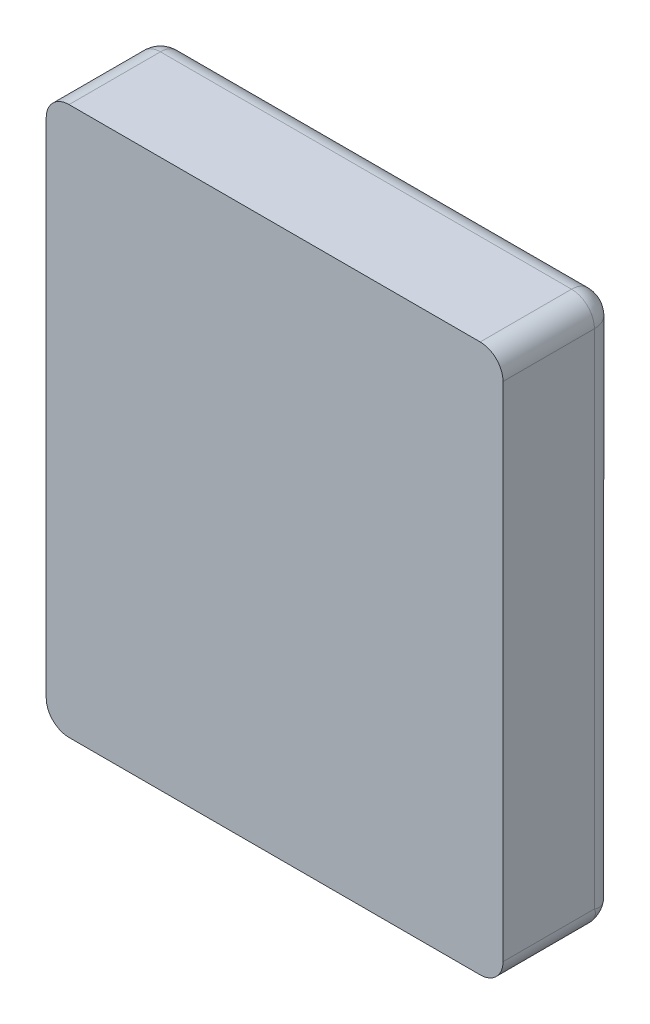
ISO-10303-21;
HEADER;
FILE_DESCRIPTION(('STEP AP214'),'2;1');
FILE_NAME('part.step','',(''),(''),'','','');
FILE_SCHEMA(('AUTOMOTIVE_DESIGN { 1 0 10303 214 1 1 1 1 }'));
ENDSEC;
DATA;
#1=APPLICATION_CONTEXT('core data for automotive mechanical design processes');
#2=APPLICATION_PROTOCOL_DEFINITION('international standard','automotive_design',2000,#1);
#3=PRODUCT_CONTEXT('',#1,'mechanical');
#4=PRODUCT('Part','Part','',(#3));
#5=PRODUCT_RELATED_PRODUCT_CATEGORY('part','',(#4));
#6=PRODUCT_DEFINITION_FORMATION('','',#4);
#7=PRODUCT_DEFINITION_CONTEXT('part definition',#1,'design');
#8=PRODUCT_DEFINITION('design','',#6,#7);
#9=PRODUCT_DEFINITION_SHAPE('','',#8);
#10=(LENGTH_UNIT() NAMED_UNIT(*) SI_UNIT(.MILLI.,.METRE.));
#11=(NAMED_UNIT(*) PLANE_ANGLE_UNIT() SI_UNIT($,.RADIAN.));
#12=(NAMED_UNIT(*) SI_UNIT($,.STERADIAN.) SOLID_ANGLE_UNIT());
#13=UNCERTAINTY_MEASURE_WITH_UNIT(LENGTH_MEASURE(1.E-05),#10,'distance_accuracy_value','');
#14=(GEOMETRIC_REPRESENTATION_CONTEXT(3) GLOBAL_UNCERTAINTY_ASSIGNED_CONTEXT((#13)) GLOBAL_UNIT_ASSIGNED_CONTEXT((#10,
#11,#12)) REPRESENTATION_CONTEXT('',''));
#15=CARTESIAN_POINT('',(0.,0.,0.));
#16=DIRECTION('',(0.,0.,1.));
#17=DIRECTION('',(1.,0.,0.));
#18=AXIS2_PLACEMENT_3D('',#15,#16,#17);
#19=CARTESIAN_POINT('',(2.2,1.55,0.05));
#20=DIRECTION('',(-0.40824829046386,-0.40824829046386,-0.816496580927729));
#21=DIRECTION('',(0.577350269189631,0.577350269189625,-0.577350269189622));
#22=AXIS2_PLACEMENT_3D('',#19,#20,#21);
#23=SPHERICAL_SURFACE('',#22,0.05);
#24=CARTESIAN_POINT('',(2.2,1.55,0.05));
#25=DIRECTION('',(0.,1.,0.));
#26=DIRECTION('',(0.,0.,-1.));
#27=AXIS2_PLACEMENT_3D('',#24,#25,#26);
#28=CIRCLE('',#27,0.05);
#29=CARTESIAN_POINT('',(2.25,1.55,0.05));
#30=VERTEX_POINT('',#29);
#31=CARTESIAN_POINT('',(2.2,1.55,0.));
#32=VERTEX_POINT('',#31);
#33=EDGE_CURVE('E11',#30,#32,#28,.T.);
#34=ORIENTED_EDGE('',*,*,#33,.T.);
#35=CARTESIAN_POINT('',(2.2,1.55,0.05));
#36=DIRECTION('',(1.,0.,0.));
#37=DIRECTION('',(0.,1.,0.));
#38=AXIS2_PLACEMENT_3D('',#35,#36,#37);
#39=CIRCLE('',#38,0.05);
#40=CARTESIAN_POINT('',(2.2,1.6,0.05));
#41=VERTEX_POINT('',#40);
#42=EDGE_CURVE('E24',#32,#41,#39,.T.);
#43=ORIENTED_EDGE('',*,*,#42,.T.);
#44=CARTESIAN_POINT('',(2.2,1.55,0.05));
#45=DIRECTION('',(0.,0.,-1.));
#46=DIRECTION('',(1.,0.,0.));
#47=AXIS2_PLACEMENT_3D('',#44,#45,#46);
#48=CIRCLE('',#47,0.05);
#49=EDGE_CURVE('E107',#41,#30,#48,.T.);
#50=ORIENTED_EDGE('',*,*,#49,.T.);
#51=EDGE_LOOP('',(#34,#43,#50));
#52=FACE_BOUND('',#51,.T.);
#53=ADVANCED_FACE('F17',(#52),#23,.T.);
#54=CARTESIAN_POINT('',(2.2,0.45,0.05));
#55=DIRECTION('',(-0.816496580927728,-0.408248290463861,-0.40824829046386));
#56=DIRECTION('',(0.577350269189622,-0.577350269189628,-0.577350269189627));
#57=AXIS2_PLACEMENT_3D('',#54,#55,#56);
#58=SPHERICAL_SURFACE('',#57,0.05);
#59=CARTESIAN_POINT('',(2.25,0.45,0.0499999999999998));
#60=CARTESIAN_POINT('',(2.2500000014759,0.449651799057068,0.0498405532686794));
#61=CARTESIAN_POINT('',(2.24999560007552,0.449301904667834,0.0496848150261169));
#62=CARTESIAN_POINT('',(2.24997796950743,0.448597828470979,0.0493801632160352));
#63=CARTESIAN_POINT('',(2.24996470752091,0.448243635548406,0.0492312772281741));
#64=CARTESIAN_POINT('',(2.24992926760641,0.447531331343161,0.048940381816176));
#65=CARTESIAN_POINT('',(2.24990705649925,0.44717321035739,0.048798400210219));
#66=CARTESIAN_POINT('',(2.24985363936352,0.446453420667875,0.0485213514872185));
#67=CARTESIAN_POINT('',(2.24982239989622,0.446091743694303,0.0483863123143094));
#68=CARTESIAN_POINT('',(2.24975085351182,0.445365215858316,0.048123176581545));
#69=CARTESIAN_POINT('',(2.2497105129861,0.445000358177561,0.0479951079959893));
#70=CARTESIAN_POINT('',(2.24962069975311,0.444267846578135,0.0477459310107218));
#71=CARTESIAN_POINT('',(2.24957119336077,0.443900187304339,0.0476248505186724));
#72=CARTESIAN_POINT('',(2.24946298976778,0.443162447258047,0.0473896555588762));
#73=CARTESIAN_POINT('',(2.2494042588909,0.442792362571634,0.0472755688333025));
#74=CARTESIAN_POINT('',(2.24927756015494,0.442050167395681,0.047054361118223));
#75=CARTESIAN_POINT('',(2.24920955873537,0.441678054492499,0.0469472676303905));
#76=CARTESIAN_POINT('',(2.2489912289485,0.440557187707727,0.0466358451686539));
#77=CARTESIAN_POINT('',(2.24882716569432,0.439807939572477,0.0464426562736404));
#78=CARTESIAN_POINT('',(2.24846180182021,0.438305940462555,0.0460837510376662));
#79=CARTESIAN_POINT('',(2.24826023919175,0.437553203614566,0.045918244601583));
#80=CARTESIAN_POINT('',(2.24781974846915,0.436047214861804,0.0456142824809017));
#81=CARTESIAN_POINT('',(2.24758056582694,0.435293997073049,0.0454760267006071));
#82=CARTESIAN_POINT('',(2.24706485201088,0.433790104728138,0.0452260083926237));
#83=CARTESIAN_POINT('',(2.24678807615493,0.433039482961546,0.0451144338874249));
#84=CARTESIAN_POINT('',(2.24619732289344,0.431543791912131,0.0449170570292828));
#85=CARTESIAN_POINT('',(2.2458831127108,0.430798791652052,0.0448314290670077));
#86=CARTESIAN_POINT('',(2.24521777475648,0.429317319104762,0.0446850740184743));
#87=CARTESIAN_POINT('',(2.24486642792602,0.428580929542474,0.0446245063781685));
#88=CARTESIAN_POINT('',(2.24412723787,0.427119599086168,0.044527253768801));
#89=CARTESIAN_POINT('',(2.24373919083561,0.426394751815757,0.0444907123562372));
#90=CARTESIAN_POINT('',(2.24292716009926,0.424959360939523,0.0444403540608963));
#91=CARTESIAN_POINT('',(2.24250298909048,0.424248918912744,0.044426664286739));
#92=CARTESIAN_POINT('',(2.24161940890336,0.422845114554765,0.0444207181221763));
#93=CARTESIAN_POINT('',(2.24115982988534,0.422151858721145,0.0444285722064916));
#94=CARTESIAN_POINT('',(2.24020627067896,0.420785111651415,0.0444642974692499));
#95=CARTESIAN_POINT('',(2.23971213879615,0.420111728763673,0.0444922626613214));
#96=CARTESIAN_POINT('',(2.23869044842568,0.418787309441907,0.0445666771817415));
#97=CARTESIAN_POINT('',(2.23816275678178,0.418136380160979,0.0446132045740465));
#98=CARTESIAN_POINT('',(2.23707505745919,0.416859335503659,0.0447231029909741));
#99=CARTESIAN_POINT('',(2.23651493527515,0.416233323109753,0.0447865369560408));
#100=CARTESIAN_POINT('',(2.2353636192483,0.415008454460619,0.0449285101707249));
#101=CARTESIAN_POINT('',(2.2347723293902,0.414409694156524,0.0450070983509291));
#102=CARTESIAN_POINT('',(2.23356005336898,0.413241536515073,0.0451775540422923));
#103=CARTESIAN_POINT('',(2.23293898925504,0.412672225390671,0.0452694578455206));
#104=CARTESIAN_POINT('',(2.23166866760279,0.411565028009956,0.045464641942522));
#105=CARTESIAN_POINT('',(2.23101934949802,0.411027215710412,0.0455679474870254));
#106=CARTESIAN_POINT('',(2.22969414620939,0.409984924151519,0.0457839664838229));
#107=CARTESIAN_POINT('',(2.2290182169205,0.409480504294321,0.0458966959351089));
#108=CARTESIAN_POINT('',(2.22764153641367,0.408506744022157,0.0461295399317951));
#109=CARTESIAN_POINT('',(2.22694075639946,0.408037446402736,0.0462496631718509));
#110=CARTESIAN_POINT('',(2.22551623315645,0.407135507998663,0.046495229519472));
#111=CARTESIAN_POINT('',(2.22479247507204,0.406702891620645,0.0466206760870282));
#112=CARTESIAN_POINT('',(2.2233239621661,0.405875717680122,0.0468747935125628));
#113=CARTESIAN_POINT('',(2.22257920486178,0.405481164642535,0.0470034647516007));
#114=CARTESIAN_POINT('',(2.22107076141787,0.404731338415788,0.0472619178362775));
#115=CARTESIAN_POINT('',(2.2203070834178,0.40437604868312,0.0473916991891467));
#116=CARTESIAN_POINT('',(2.21876296105217,0.40370578451402,0.0476502530710441));
#117=CARTESIAN_POINT('',(2.21798253353389,0.403390771598533,0.0477790264509255));
#118=CARTESIAN_POINT('',(2.21640716184318,0.402801907185964,0.0480334516240748));
#119=CARTESIAN_POINT('',(2.21561224116745,0.402527994737248,0.0481591078044245));
#120=CARTESIAN_POINT('',(2.21401021227114,0.402021985315631,0.0484052048771467));
#121=CARTESIAN_POINT('',(2.21320313201674,0.401789804718976,0.0485256558233742));
#122=CARTESIAN_POINT('',(2.21157918442682,0.401367718941433,0.0487592801323913));
#123=CARTESIAN_POINT('',(2.21076234724915,0.401177707607652,0.0488724712471381));
#124=CARTESIAN_POINT('',(2.20912134835722,0.400840226036591,0.0490895570997498));
#125=CARTESIAN_POINT('',(2.20829721664536,0.400692627601644,0.0491934791832936));
#126=CARTESIAN_POINT('',(2.20664414679495,0.400440040497442,0.0493900639666642));
#127=CARTESIAN_POINT('',(2.20581523610608,0.400334902420738,0.0494827653283566));
#128=CARTESIAN_POINT('',(2.20415516357154,0.400167119131942,0.0496550119985609));
#129=CARTESIAN_POINT('',(2.20332402424875,0.400104304434963,0.0497346088043771));
#130=CARTESIAN_POINT('',(2.20166211112483,0.400020828682451,0.0498788316884434));
#131=CARTESIAN_POINT('',(2.20083135242767,0.399999979686033,0.0499435233591183));
#132=CARTESIAN_POINT('',(2.2,0.4,0.0500000000000001));
#133=B_SPLINE_CURVE_WITH_KNOTS('',3,(#59,#60,#61,#62,#63,#64,#65,#66,#67,#68,#69,#70,#71,#72,
#73,#74,#75,#76,#77,#78,#79,#80,#81,#82,#83,#84,#85,#86,#87,#88,#89,#90,#91,#92,#93,#94,#95,#96,
#97,#98,#99,#100,#101,#102,#103,#104,#105,#106,#107,#108,#109,#110,#111,#112,#113,#114,#115,
#116,#117,#118,#119,#120,#121,#122,#123,#124,#125,#126,#127,#128,#129,#130,#131,#132),
.UNSPECIFIED.,.F.,.F.,(4,2,2,2,2,2,2,2,2,2,2,2,2,2,2,2,2,2,2,2,2,2,2,2,2,2,2,2,2,2,2,2,2,2,2,2,
4),(0.,0.00114886127774822,0.00230200160017932,0.00345945716025889,0.004621255816402,
0.00578741713336718,0.00695795243877276,0.00813286489441382,0.00931214958156473,
0.0116835195945682,0.0140721270255091,0.0164776530081181,0.0188996616232038,0.0213376051995541,
0.0237908300995736,0.026258582918328,0.0287400170325545,0.0312341994438155,0.0337401178671161,
0.0362566880228797,0.0387827610961028,0.0413171313317718,0.0438585437402055,0.046405701889917,
0.0489572757688813,0.0515119096977958,0.0540682302810434,0.0566248543826749,0.0591803971157915,
0.0617334798343146,0.0642827381162205,0.0668268297269537,0.0693644425508582,0.0718943024771084,
0.0744151812247205,0.0769259040887937,0.0794253575870826),.UNSPECIFIED.);
#134=CARTESIAN_POINT('',(2.25,0.45,0.05));
#135=VERTEX_POINT('',#134);
#136=CARTESIAN_POINT('',(2.2,0.4,0.05));
#137=VERTEX_POINT('',#136);
#138=EDGE_CURVE('E280',#135,#137,#133,.T.);
#139=ORIENTED_EDGE('',*,*,#138,.T.);
#140=CARTESIAN_POINT('',(2.2,0.45,0.05));
#141=DIRECTION('',(1.,0.,0.));
#142=DIRECTION('',(0.,0.,-1.));
#143=AXIS2_PLACEMENT_3D('',#140,#141,#142);
#144=CIRCLE('',#143,0.05);
#145=CARTESIAN_POINT('',(2.2,0.45,0.));
#146=VERTEX_POINT('',#145);
#147=EDGE_CURVE('E272',#137,#146,#144,.T.);
#148=ORIENTED_EDGE('',*,*,#147,.T.);
#149=CARTESIAN_POINT('',(2.2,0.45,0.));
#150=CARTESIAN_POINT('',(2.20083135242767,0.449943523359118,-2.03139668969687E-08));
#151=CARTESIAN_POINT('',(2.20166211112483,0.449878831688443,2.08286824513829E-05));
#152=CARTESIAN_POINT('',(2.20332402424875,0.449734608804377,0.000104304434962557));
#153=CARTESIAN_POINT('',(2.20415516357154,0.449655011998561,0.000167119131942042));
#154=CARTESIAN_POINT('',(2.20581523610608,0.449482765328356,0.000334902420738287));
#155=CARTESIAN_POINT('',(2.20664414679495,0.449390063966664,0.000440040497442491));
#156=CARTESIAN_POINT('',(2.20829721664536,0.449193479183294,0.00069262760164451));
#157=CARTESIAN_POINT('',(2.20912134835722,0.44908955709975,0.000840226036591026));
#158=CARTESIAN_POINT('',(2.21076234724915,0.448872471247138,0.00117770760765164));
#159=CARTESIAN_POINT('',(2.21157918442682,0.448759280132391,0.00136771894143308));
#160=CARTESIAN_POINT('',(2.21320313201674,0.448525655823374,0.00178980471897601));
#161=CARTESIAN_POINT('',(2.21401021227114,0.448405204877147,0.00202198531563088));
#162=CARTESIAN_POINT('',(2.21561224116745,0.448159107804424,0.00252799473724829));
#163=CARTESIAN_POINT('',(2.21640716184318,0.448033451624075,0.00280190718596445));
#164=CARTESIAN_POINT('',(2.21798253353389,0.447779026450925,0.00339077159853349));
#165=CARTESIAN_POINT('',(2.21876296105217,0.447650253071044,0.0037057845140203));
#166=CARTESIAN_POINT('',(2.2203070834178,0.447391699189147,0.00437604868311969));
#167=CARTESIAN_POINT('',(2.22107076141787,0.447261917836277,0.00473133841578777));
#168=CARTESIAN_POINT('',(2.22257920486178,0.447003464751601,0.00548116464253514));
#169=CARTESIAN_POINT('',(2.2233239621661,0.446874793512563,0.00587571768012167));
#170=CARTESIAN_POINT('',(2.22479247507204,0.446620676087028,0.00670289162064457));
#171=CARTESIAN_POINT('',(2.22551623315645,0.446495229519472,0.00713550799866312));
#172=CARTESIAN_POINT('',(2.22694075639946,0.446249663171851,0.00803744640273559));
#173=CARTESIAN_POINT('',(2.22764153641367,0.446129539931795,0.00850674402215674));
#174=CARTESIAN_POINT('',(2.2290182169205,0.445896695935109,0.00948050429432061));
#175=CARTESIAN_POINT('',(2.22969414620938,0.445783966483823,0.00998492415151899));
#176=CARTESIAN_POINT('',(2.23101934949802,0.445567947487025,0.0110272157104115));
#177=CARTESIAN_POINT('',(2.23166866760279,0.445464641942522,0.011565028009956));
#178=CARTESIAN_POINT('',(2.23293898925504,0.445269457845521,0.0126722253906707));
#179=CARTESIAN_POINT('',(2.23356005336898,0.445177554042292,0.0132415365150733));
#180=CARTESIAN_POINT('',(2.2347723293902,0.445007098350929,0.014409694156524));
#181=CARTESIAN_POINT('',(2.2353636192483,0.444928510170725,0.0150084544606194));
#182=CARTESIAN_POINT('',(2.23651493527515,0.444786536956041,0.0162333231097525));
#183=CARTESIAN_POINT('',(2.23707505745919,0.444723102990974,0.0168593355036591));
#184=CARTESIAN_POINT('',(2.23816275678178,0.444613204574046,0.018136380160979));
#185=CARTESIAN_POINT('',(2.23869044842568,0.444566677181741,0.0187873094419069));
#186=CARTESIAN_POINT('',(2.23971213879615,0.444492262661321,0.020111728763673));
#187=CARTESIAN_POINT('',(2.24020627067896,0.44446429746925,0.0207851116514151));
#188=CARTESIAN_POINT('',(2.24115982988534,0.444428572206491,0.0221518587211451));
#189=CARTESIAN_POINT('',(2.24161940890336,0.444420718122176,0.0228451145547648));
#190=CARTESIAN_POINT('',(2.24250298909048,0.444426664286739,0.0242489189127444));
#191=CARTESIAN_POINT('',(2.24292716009926,0.444440354060896,0.0249593609395228));
#192=CARTESIAN_POINT('',(2.24373919083561,0.444490712356237,0.0263947518157566));
#193=CARTESIAN_POINT('',(2.24412723787,0.444527253768801,0.0271195990861676));
#194=CARTESIAN_POINT('',(2.24486642792602,0.444624506378168,0.0285809295424737));
#195=CARTESIAN_POINT('',(2.24521777475648,0.444685074018474,0.029317319104762));
#196=CARTESIAN_POINT('',(2.2458831127108,0.444831429067008,0.0307987916520523));
#197=CARTESIAN_POINT('',(2.24619732289344,0.444917057029283,0.0315437919121314));
#198=CARTESIAN_POINT('',(2.24678807615493,0.445114433887425,0.0330394829615456));
#199=CARTESIAN_POINT('',(2.24706485201088,0.445226008392624,0.0337901047281376));
#200=CARTESIAN_POINT('',(2.24758056582694,0.445476026700607,0.0352939970730489));
#201=CARTESIAN_POINT('',(2.24781974846915,0.445614282480902,0.0360472148618043));
#202=CARTESIAN_POINT('',(2.24826023919175,0.445918244601583,0.0375532036145657));
#203=CARTESIAN_POINT('',(2.24846180182021,0.446083751037666,0.0383059404625553));
#204=CARTESIAN_POINT('',(2.24882716569432,0.44644265627364,0.0398079395724775));
#205=CARTESIAN_POINT('',(2.2489912289485,0.446635845168654,0.0405571877077266));
#206=CARTESIAN_POINT('',(2.24920955873537,0.44694726763039,0.041678054492499));
#207=CARTESIAN_POINT('',(2.24927756015494,0.447054361118223,0.0420501673956812));
#208=CARTESIAN_POINT('',(2.2494042588909,0.447275568833302,0.0427923625716339));
#209=CARTESIAN_POINT('',(2.24946298976778,0.447389655558876,0.0431624472580471));
#210=CARTESIAN_POINT('',(2.24957119336077,0.447624850518672,0.0439001873043392));
#211=CARTESIAN_POINT('',(2.24962069975311,0.447745931010722,0.0442678465781352));
#212=CARTESIAN_POINT('',(2.2497105129861,0.447995107995989,0.0450003581775607));
#213=CARTESIAN_POINT('',(2.24975085351182,0.448123176581545,0.0453652158583163));
#214=CARTESIAN_POINT('',(2.24982239989622,0.448386312314309,0.0460917436943031));
#215=CARTESIAN_POINT('',(2.24985363936352,0.448521351487218,0.0464534206678747));
#216=CARTESIAN_POINT('',(2.24990705649925,0.448798400210219,0.0471732103573898));
#217=CARTESIAN_POINT('',(2.24992926760641,0.448940381816176,0.0475313313431614));
#218=CARTESIAN_POINT('',(2.24996470752091,0.449231277228174,0.0482436355484061));
#219=CARTESIAN_POINT('',(2.24997796950743,0.449380163216035,0.0485978284709787));
#220=CARTESIAN_POINT('',(2.24999560007552,0.449684815026117,0.0493019046678336));
#221=CARTESIAN_POINT('',(2.2500000014759,0.449840553268679,0.0496517990570677));
#222=CARTESIAN_POINT('',(2.25,0.45,0.0499999999999998));
#223=B_SPLINE_CURVE_WITH_KNOTS('',3,(#149,#150,#151,#152,#153,#154,#155,#156,#157,#158,#159,
#160,#161,#162,#163,#164,#165,#166,#167,#168,#169,#170,#171,#172,#173,#174,#175,#176,#177,#178,
#179,#180,#181,#182,#183,#184,#185,#186,#187,#188,#189,#190,#191,#192,#193,#194,#195,#196,#197,
#198,#199,#200,#201,#202,#203,#204,#205,#206,#207,#208,#209,#210,#211,#212,#213,#214,#215,#216,
#217,#218,#219,#220,#221,#222),.UNSPECIFIED.,.F.,.F.,(4,2,2,2,2,2,2,2,2,2,2,2,2,2,2,2,2,2,2,2,2,
2,2,2,2,2,2,2,2,2,2,2,2,2,2,2,4),(0.,0.00249945349828886,0.00501017636236206,
0.00753105510997416,0.0100609150362244,0.0125985278601289,0.0151426194708621,0.017691877752768,
0.0202449604712911,0.0228005032044077,0.0253571273060392,0.0279134478892868,0.0304680818182009,
0.0330196556971656,0.0355668138468771,0.0381082262553108,0.0406425964909797,0.0431686695642028,
0.0456852397199665,0.0481911581432671,0.0506853405545281,0.0531667746687545,0.0556345274875089,
0.0580877523875284,0.0605256959638787,0.0629477045789644,0.0653532305615735,0.0677418379925144,
0.0701132080055178,0.0712924926926687,0.0724674051483098,0.0736379404537154,0.0748041017706806,
0.0759659004268237,0.0771233559869033,0.0782764963093344,0.0794253575870826),.UNSPECIFIED.);
#224=EDGE_CURVE('E246',#146,#135,#223,.T.);
#225=ORIENTED_EDGE('',*,*,#224,.T.);
#226=EDGE_LOOP('',(#139,#148,#225));
#227=FACE_BOUND('',#226,.T.);
#228=ADVANCED_FACE('F286',(#227),#58,.T.);
#229=CARTESIAN_POINT('',(1.3,1.55,0.05));
#230=DIRECTION('',(-0.816496580927727,-0.408248290463863,0.408248290463862));
#231=DIRECTION('',(-0.577350269189625,0.577350269189627,-0.577350269189626));
#232=AXIS2_PLACEMENT_3D('',#229,#230,#231);
#233=SPHERICAL_SURFACE('',#232,0.05);
#234=CARTESIAN_POINT('',(1.3,1.55,0.05));
#235=DIRECTION('',(0.,0.,-1.));
#236=DIRECTION('',(0.,1.,0.));
#237=AXIS2_PLACEMENT_3D('',#234,#235,#236);
#238=CIRCLE('',#237,0.05);
#239=CARTESIAN_POINT('',(1.25,1.55,0.05));
#240=VERTEX_POINT('',#239);
#241=CARTESIAN_POINT('',(1.3,1.6,0.05));
#242=VERTEX_POINT('',#241);
#243=EDGE_CURVE('E244',#240,#242,#238,.T.);
#244=ORIENTED_EDGE('',*,*,#243,.T.);
#245=CARTESIAN_POINT('',(1.3,1.55,0.05));
#246=DIRECTION('',(-1.,0.,0.));
#247=DIRECTION('',(0.,0.,-1.));
#248=AXIS2_PLACEMENT_3D('',#245,#246,#247);
#249=CIRCLE('',#248,0.05);
#250=CARTESIAN_POINT('',(1.3,1.55,0.));
#251=VERTEX_POINT('',#250);
#252=EDGE_CURVE('E242',#242,#251,#249,.T.);
#253=ORIENTED_EDGE('',*,*,#252,.T.);
#254=CARTESIAN_POINT('',(1.3,1.55,0.05));
#255=DIRECTION('',(0.,1.,0.));
#256=DIRECTION('',(-1.,0.,0.));
#257=AXIS2_PLACEMENT_3D('',#254,#255,#256);
#258=CIRCLE('',#257,0.05);
#259=EDGE_CURVE('E239',#251,#240,#258,.T.);
#260=ORIENTED_EDGE('',*,*,#259,.T.);
#261=EDGE_LOOP('',(#244,#253,#260));
#262=FACE_BOUND('',#261,.T.);
#263=ADVANCED_FACE('F294',(#262),#233,.T.);
#264=CARTESIAN_POINT('',(2.,1.55,0.05));
#265=DIRECTION('',(-1.,0.,0.));
#266=DIRECTION('',(0.,0.707106781186548,-0.707106781186547));
#267=AXIS2_PLACEMENT_3D('',#264,#265,#266);
#268=CYLINDRICAL_SURFACE('',#267,0.05);
#269=ORIENTED_EDGE('',*,*,#252,.F.);
#270=DIRECTION('',(1.,0.,0.));
#271=VECTOR('',#270,1.);
#272=CARTESIAN_POINT('',(2.,1.6,0.05));
#273=LINE('',#272,#271);
#274=EDGE_CURVE('E237',#242,#41,#273,.T.);
#275=ORIENTED_EDGE('',*,*,#274,.T.);
#276=ORIENTED_EDGE('',*,*,#42,.F.);
#277=DIRECTION('',(-1.,0.,0.));
#278=VECTOR('',#277,1.);
#279=CARTESIAN_POINT('',(2.,1.55,0.));
#280=LINE('',#279,#278);
#281=EDGE_CURVE('E234',#32,#251,#280,.T.);
#282=ORIENTED_EDGE('',*,*,#281,.T.);
#283=EDGE_LOOP('',(#269,#275,#276,#282));
#284=FACE_BOUND('',#283,.T.);
#285=ADVANCED_FACE('F221',(#284),#268,.T.);
#286=CARTESIAN_POINT('',(1.3,0.45,0.05));
#287=DIRECTION('',(-0.816496580927727,0.408248290463862,0.408248290463862));
#288=DIRECTION('',(-0.577350269189624,-0.577350269189627,-0.577350269189626));
#289=AXIS2_PLACEMENT_3D('',#286,#287,#288);
#290=SPHERICAL_SURFACE('',#289,0.05);
#291=CARTESIAN_POINT('',(1.3,0.4,0.0499999999999998));
#292=CARTESIAN_POINT('',(1.29916864757233,0.399999979686033,0.0499435233591181));
#293=CARTESIAN_POINT('',(1.29833788887517,0.400020828682451,0.0498788316884432));
#294=CARTESIAN_POINT('',(1.29667597575125,0.400104304434963,0.0497346088043769));
#295=CARTESIAN_POINT('',(1.29584483642846,0.400167119131942,0.0496550119985608));
#296=CARTESIAN_POINT('',(1.29418476389392,0.400334902420738,0.0494827653283564));
#297=CARTESIAN_POINT('',(1.29335585320505,0.400440040497442,0.049390063966664));
#298=CARTESIAN_POINT('',(1.29170278335464,0.400692627601645,0.0491934791832935));
#299=CARTESIAN_POINT('',(1.29087865164278,0.400840226036591,0.0490895570997496));
#300=CARTESIAN_POINT('',(1.28923765275085,0.401177707607652,0.0488724712471379));
#301=CARTESIAN_POINT('',(1.28842081557318,0.401367718941433,0.0487592801323911));
#302=CARTESIAN_POINT('',(1.28679686798326,0.401789804718976,0.048525655823374));
#303=CARTESIAN_POINT('',(1.28598978772886,0.402021985315631,0.0484052048771466));
#304=CARTESIAN_POINT('',(1.28438775883255,0.402527994737248,0.0481591078044244));
#305=CARTESIAN_POINT('',(1.28359283815682,0.402801907185965,0.0480334516240747));
#306=CARTESIAN_POINT('',(1.28201746646611,0.403390771598534,0.0477790264509253));
#307=CARTESIAN_POINT('',(1.28123703894783,0.40370578451402,0.047650253071044));
#308=CARTESIAN_POINT('',(1.2796929165822,0.40437604868312,0.0473916991891466));
#309=CARTESIAN_POINT('',(1.27892923858213,0.404731338415788,0.0472619178362774));
#310=CARTESIAN_POINT('',(1.27742079513822,0.405481164642535,0.0470034647516005));
#311=CARTESIAN_POINT('',(1.2766760378339,0.405875717680122,0.0468747935125627));
#312=CARTESIAN_POINT('',(1.27520752492796,0.406702891620645,0.0466206760870282));
#313=CARTESIAN_POINT('',(1.27448376684355,0.407135507998663,0.0464952295194719));
#314=CARTESIAN_POINT('',(1.27305924360054,0.408037446402736,0.0462496631718508));
#315=CARTESIAN_POINT('',(1.27235846358633,0.408506744022157,0.0461295399317951));
#316=CARTESIAN_POINT('',(1.2709817830795,0.409480504294321,0.0458966959351089));
#317=CARTESIAN_POINT('',(1.27030585379061,0.409984924151519,0.0457839664838228));
#318=CARTESIAN_POINT('',(1.26898065050198,0.411027215710412,0.0455679474870254));
#319=CARTESIAN_POINT('',(1.26833133239721,0.411565028009956,0.045464641942522));
#320=CARTESIAN_POINT('',(1.26706101074496,0.412672225390671,0.0452694578455206));
#321=CARTESIAN_POINT('',(1.26643994663102,0.413241536515074,0.0451775540422922));
#322=CARTESIAN_POINT('',(1.2652276706098,0.414409694156524,0.045007098350929));
#323=CARTESIAN_POINT('',(1.2646363807517,0.41500845446062,0.0449285101707248));
#324=CARTESIAN_POINT('',(1.26348506472485,0.416233323109753,0.0447865369560408));
#325=CARTESIAN_POINT('',(1.26292494254081,0.416859335503659,0.0447231029909741));
#326=CARTESIAN_POINT('',(1.26183724321822,0.418136380160979,0.0446132045740465));
#327=CARTESIAN_POINT('',(1.26130955157432,0.418787309441907,0.0445666771817415));
#328=CARTESIAN_POINT('',(1.26028786120385,0.420111728763673,0.0444922626613214));
#329=CARTESIAN_POINT('',(1.25979372932104,0.420785111651415,0.04446429746925));
#330=CARTESIAN_POINT('',(1.25884017011466,0.422151858721145,0.0444285722064916));
#331=CARTESIAN_POINT('',(1.25838059109664,0.422845114554765,0.0444207181221763));
#332=CARTESIAN_POINT('',(1.25749701090952,0.424248918912745,0.044426664286739));
#333=CARTESIAN_POINT('',(1.25707283990074,0.424959360939523,0.0444403540608964));
#334=CARTESIAN_POINT('',(1.25626080916439,0.426394751815757,0.0444907123562373));
#335=CARTESIAN_POINT('',(1.25587276213,0.427119599086168,0.0445272537688011));
#336=CARTESIAN_POINT('',(1.25513357207398,0.428580929542474,0.0446245063781686));
#337=CARTESIAN_POINT('',(1.25478222524352,0.429317319104762,0.0446850740184744));
#338=CARTESIAN_POINT('',(1.2541168872892,0.430798791652052,0.0448314290670078));
#339=CARTESIAN_POINT('',(1.25380267710656,0.431543791912132,0.0449170570292829));
#340=CARTESIAN_POINT('',(1.25321192384507,0.433039482961546,0.045114433887425));
#341=CARTESIAN_POINT('',(1.25293514798912,0.433790104728138,0.0452260083926238));
#342=CARTESIAN_POINT('',(1.25241943417306,0.435293997073049,0.0454760267006072));
#343=CARTESIAN_POINT('',(1.25218025153085,0.436047214861804,0.0456142824809018));
#344=CARTESIAN_POINT('',(1.25173976080825,0.437553203614566,0.0459182446015831));
#345=CARTESIAN_POINT('',(1.25153819817979,0.438305940462555,0.0460837510376663));
#346=CARTESIAN_POINT('',(1.25117283430568,0.439807939572478,0.0464426562736405));
#347=CARTESIAN_POINT('',(1.2510087710515,0.440557187707727,0.0466358451686541));
#348=CARTESIAN_POINT('',(1.25079044126463,0.441678054492499,0.0469472676303907));
#349=CARTESIAN_POINT('',(1.25072243984506,0.442050167395681,0.0470543611182232));
#350=CARTESIAN_POINT('',(1.2505957411091,0.442792362571634,0.0472755688333026));
#351=CARTESIAN_POINT('',(1.25053701023222,0.443162447258047,0.0473896555588763));
#352=CARTESIAN_POINT('',(1.25042880663923,0.443900187304339,0.0476248505186726));
#353=CARTESIAN_POINT('',(1.25037930024689,0.444267846578135,0.0477459310107219));
#354=CARTESIAN_POINT('',(1.2502894870139,0.445000358177561,0.0479951079959894));
#355=CARTESIAN_POINT('',(1.25024914648818,0.445365215858316,0.0481231765815451));
#356=CARTESIAN_POINT('',(1.25017760010378,0.446091743694303,0.0483863123143096));
#357=CARTESIAN_POINT('',(1.25014636063648,0.446453420667875,0.0485213514872186));
#358=CARTESIAN_POINT('',(1.25009294350075,0.44717321035739,0.0487984002102192));
#359=CARTESIAN_POINT('',(1.25007073239359,0.447531331343162,0.0489403818161762));
#360=CARTESIAN_POINT('',(1.25003529247909,0.448243635548406,0.0492312772281742));
#361=CARTESIAN_POINT('',(1.25002203049257,0.448597828470979,0.0493801632160354));
#362=CARTESIAN_POINT('',(1.25000439992448,0.449301904667834,0.0496848150261171));
#363=CARTESIAN_POINT('',(1.2499999985241,0.449651799057068,0.0498405532686796));
#364=CARTESIAN_POINT('',(1.25,0.45,0.0499999999999999));
#365=B_SPLINE_CURVE_WITH_KNOTS('',3,(#291,#292,#293,#294,#295,#296,#297,#298,#299,#300,#301,
#302,#303,#304,#305,#306,#307,#308,#309,#310,#311,#312,#313,#314,#315,#316,#317,#318,#319,#320,
#321,#322,#323,#324,#325,#326,#327,#328,#329,#330,#331,#332,#333,#334,#335,#336,#337,#338,#339,
#340,#341,#342,#343,#344,#345,#346,#347,#348,#349,#350,#351,#352,#353,#354,#355,#356,#357,#358,
#359,#360,#361,#362,#363,#364),.UNSPECIFIED.,.F.,.F.,(4,2,2,2,2,2,2,2,2,2,2,2,2,2,2,2,2,2,2,2,2,
2,2,2,2,2,2,2,2,2,2,2,2,2,2,2,4),(0.,0.00249945349828843,0.00501017636236163,
0.00753105510997395,0.010060915036224,0.0125985278601287,0.0151426194708619,0.0176918777527678,
0.0202449604712909,0.0228005032044075,0.0253571273060388,0.0279134478892864,0.0304680818182007,
0.0330196556971652,0.0355668138468765,0.0381082262553102,0.0406425964909793,0.0431686695642025,
0.0456852397199662,0.0481911581432667,0.0506853405545276,0.053166774668754,0.0556345274875085,
0.058087752387528,0.0605256959638782,0.0629477045789639,0.065353230561573,0.0677418379925139,
0.0701132080055173,0.0712924926926682,0.0724674051483093,0.0736379404537149,0.0748041017706801,
0.0759659004268231,0.0771233559869028,0.0782764963093338,0.0794253575870821),.UNSPECIFIED.);
#366=CARTESIAN_POINT('',(1.3,0.4,0.05));
#367=VERTEX_POINT('',#366);
#368=CARTESIAN_POINT('',(1.25,0.45,0.05));
#369=VERTEX_POINT('',#368);
#370=EDGE_CURVE('E190',#367,#369,#365,.T.);
#371=ORIENTED_EDGE('',*,*,#370,.T.);
#372=CARTESIAN_POINT('',(1.3,0.45,0.05));
#373=DIRECTION('',(0.,-1.,0.));
#374=DIRECTION('',(0.,0.,-1.));
#375=AXIS2_PLACEMENT_3D('',#372,#373,#374);
#376=CIRCLE('',#375,0.05);
#377=CARTESIAN_POINT('',(1.3,0.45,0.));
#378=VERTEX_POINT('',#377);
#379=EDGE_CURVE('E186',#369,#378,#376,.T.);
#380=ORIENTED_EDGE('',*,*,#379,.T.);
#381=CARTESIAN_POINT('',(1.3,0.45,0.05));
#382=DIRECTION('',(-1.,0.,0.));
#383=DIRECTION('',(0.,-1.,0.));
#384=AXIS2_PLACEMENT_3D('',#381,#382,#383);
#385=CIRCLE('',#384,0.05);
#386=EDGE_CURVE('E181',#378,#367,#385,.T.);
#387=ORIENTED_EDGE('',*,*,#386,.T.);
#388=EDGE_LOOP('',(#371,#380,#387));
#389=FACE_BOUND('',#388,.T.);
#390=ADVANCED_FACE('F216',(#389),#290,.T.);
#391=CARTESIAN_POINT('',(1.3,1.3,0.05));
#392=DIRECTION('',(0.,-1.,0.));
#393=DIRECTION('',(-0.707106781186548,0.,-0.707106781186547));
#394=AXIS2_PLACEMENT_3D('',#391,#392,#393);
#395=CYLINDRICAL_SURFACE('',#394,0.05);
#396=ORIENTED_EDGE('',*,*,#379,.F.);
#397=DIRECTION('',(0.,1.,0.));
#398=VECTOR('',#397,1.);
#399=CARTESIAN_POINT('',(1.25,1.3,0.05));
#400=LINE('',#399,#398);
#401=EDGE_CURVE('E176',#369,#240,#400,.T.);
#402=ORIENTED_EDGE('',*,*,#401,.T.);
#403=ORIENTED_EDGE('',*,*,#259,.F.);
#404=DIRECTION('',(0.,-1.,0.));
#405=VECTOR('',#404,1.);
#406=CARTESIAN_POINT('',(1.3,1.3,0.));
#407=LINE('',#406,#405);
#408=EDGE_CURVE('E173',#251,#378,#407,.T.);
#409=ORIENTED_EDGE('',*,*,#408,.T.);
#410=EDGE_LOOP('',(#396,#402,#403,#409));
#411=FACE_BOUND('',#410,.T.);
#412=ADVANCED_FACE('F212',(#411),#395,.T.);
#413=CARTESIAN_POINT('',(1.5,0.45,0.05));
#414=DIRECTION('',(1.,0.,0.));
#415=DIRECTION('',(0.,-0.707106781186548,-0.707106781186547));
#416=AXIS2_PLACEMENT_3D('',#413,#414,#415);
#417=CYLINDRICAL_SURFACE('',#416,0.05);
#418=ORIENTED_EDGE('',*,*,#147,.F.);
#419=DIRECTION('',(-1.,0.,0.));
#420=VECTOR('',#419,1.);
#421=CARTESIAN_POINT('',(1.5,0.4,0.05));
#422=LINE('',#421,#420);
#423=EDGE_CURVE('E168',#137,#367,#422,.T.);
#424=ORIENTED_EDGE('',*,*,#423,.T.);
#425=ORIENTED_EDGE('',*,*,#386,.F.);
#426=DIRECTION('',(1.,0.,0.));
#427=VECTOR('',#426,1.);
#428=CARTESIAN_POINT('',(1.5,0.45,0.));
#429=LINE('',#428,#427);
#430=EDGE_CURVE('E163',#378,#146,#429,.T.);
#431=ORIENTED_EDGE('',*,*,#430,.T.);
#432=EDGE_LOOP('',(#418,#424,#425,#431));
#433=FACE_BOUND('',#432,.T.);
#434=ADVANCED_FACE('F207',(#433),#417,.T.);
#435=CARTESIAN_POINT('',(1.3,0.45,0.));
#436=DIRECTION('',(0.,0.,1.));
#437=DIRECTION('',(-0.707106781186548,-0.707106781186548,0.));
#438=AXIS2_PLACEMENT_3D('',#435,#436,#437);
#439=CYLINDRICAL_SURFACE('',#438,0.05);
#440=CARTESIAN_POINT('',(1.3,0.45,0.25));
#441=DIRECTION('',(0.,0.,-1.));
#442=DIRECTION('',(-0.707106781186548,-0.707106781186548,0.));
#443=AXIS2_PLACEMENT_3D('',#440,#441,#442);
#444=CIRCLE('',#443,0.05);
#445=CARTESIAN_POINT('',(1.3,0.4,0.25));
#446=VERTEX_POINT('',#445);
#447=CARTESIAN_POINT('',(1.25,0.45,0.25));
#448=VERTEX_POINT('',#447);
#449=EDGE_CURVE('E161',#446,#448,#444,.T.);
#450=ORIENTED_EDGE('',*,*,#449,.T.);
#451=DIRECTION('',(0.,0.,-1.));
#452=VECTOR('',#451,1.);
#453=CARTESIAN_POINT('',(1.25,0.45,0.));
#454=LINE('',#453,#452);
#455=EDGE_CURVE('E156',#448,#369,#454,.T.);
#456=ORIENTED_EDGE('',*,*,#455,.T.);
#457=ORIENTED_EDGE('',*,*,#370,.F.);
#458=DIRECTION('',(0.,0.,1.));
#459=VECTOR('',#458,1.);
#460=CARTESIAN_POINT('',(1.3,0.4,0.));
#461=LINE('',#460,#459);
#462=EDGE_CURVE('E151',#367,#446,#461,.T.);
#463=ORIENTED_EDGE('',*,*,#462,.T.);
#464=EDGE_LOOP('',(#450,#456,#457,#463));
#465=FACE_BOUND('',#464,.T.);
#466=ADVANCED_FACE('F196',(#465),#439,.T.);
#467=CARTESIAN_POINT('',(1.3,1.55,0.));
#468=DIRECTION('',(0.,0.,1.));
#469=DIRECTION('',(-0.707106781186548,0.707106781186548,0.));
#470=AXIS2_PLACEMENT_3D('',#467,#468,#469);
#471=CYLINDRICAL_SURFACE('',#470,0.05);
#472=CARTESIAN_POINT('',(1.3,1.55,0.25));
#473=DIRECTION('',(0.,0.,-1.));
#474=DIRECTION('',(-0.707106781186548,0.707106781186548,0.));
#475=AXIS2_PLACEMENT_3D('',#472,#473,#474);
#476=CIRCLE('',#475,0.05);
#477=CARTESIAN_POINT('',(1.25,1.55,0.25));
#478=VERTEX_POINT('',#477);
#479=CARTESIAN_POINT('',(1.3,1.6,0.25));
#480=VERTEX_POINT('',#479);
#481=EDGE_CURVE('E149',#478,#480,#476,.T.);
#482=ORIENTED_EDGE('',*,*,#481,.T.);
#483=DIRECTION('',(0.,0.,-1.));
#484=VECTOR('',#483,1.);
#485=CARTESIAN_POINT('',(1.3,1.6,0.));
#486=LINE('',#485,#484);
#487=EDGE_CURVE('E116',#480,#242,#486,.T.);
#488=ORIENTED_EDGE('',*,*,#487,.T.);
#489=ORIENTED_EDGE('',*,*,#243,.F.);
#490=DIRECTION('',(0.,0.,1.));
#491=VECTOR('',#490,1.);
#492=CARTESIAN_POINT('',(1.25,1.55,0.));
#493=LINE('',#492,#491);
#494=EDGE_CURVE('E145',#240,#478,#493,.T.);
#495=ORIENTED_EDGE('',*,*,#494,.T.);
#496=EDGE_LOOP('',(#482,#488,#489,#495));
#497=FACE_BOUND('',#496,.T.);
#498=ADVANCED_FACE('F206',(#497),#471,.T.);
#499=CARTESIAN_POINT('',(2.2,0.7,0.05));
#500=DIRECTION('',(0.,1.,0.));
#501=DIRECTION('',(0.707106781186548,0.,-0.707106781186547));
#502=AXIS2_PLACEMENT_3D('',#499,#500,#501);
#503=CYLINDRICAL_SURFACE('',#502,0.05);
#504=ORIENTED_EDGE('',*,*,#33,.F.);
#505=DIRECTION('',(0.,-1.,0.));
#506=VECTOR('',#505,1.);
#507=CARTESIAN_POINT('',(2.25,0.7,0.05));
#508=LINE('',#507,#506);
#509=EDGE_CURVE('E141',#30,#135,#508,.T.);
#510=ORIENTED_EDGE('',*,*,#509,.T.);
#511=ORIENTED_EDGE('',*,*,#224,.F.);
#512=DIRECTION('',(0.,1.,0.));
#513=VECTOR('',#512,1.);
#514=CARTESIAN_POINT('',(2.2,0.7,0.));
#515=LINE('',#514,#513);
#516=EDGE_CURVE('E137',#146,#32,#515,.T.);
#517=ORIENTED_EDGE('',*,*,#516,.T.);
#518=EDGE_LOOP('',(#504,#510,#511,#517));
#519=FACE_BOUND('',#518,.T.);
#520=ADVANCED_FACE('F252',(#519),#503,.T.);
#521=CARTESIAN_POINT('',(2.2,0.45,0.));
#522=DIRECTION('',(0.,0.,1.));
#523=DIRECTION('',(0.707106781186548,-0.707106781186548,0.));
#524=AXIS2_PLACEMENT_3D('',#521,#522,#523);
#525=CYLINDRICAL_SURFACE('',#524,0.05);
#526=CARTESIAN_POINT('',(2.2,0.45,0.25));
#527=DIRECTION('',(0.,0.,-1.));
#528=DIRECTION('',(0.707106781186548,-0.707106781186548,0.));
#529=AXIS2_PLACEMENT_3D('',#526,#527,#528);
#530=CIRCLE('',#529,0.05);
#531=CARTESIAN_POINT('',(2.25,0.45,0.25));
#532=VERTEX_POINT('',#531);
#533=CARTESIAN_POINT('',(2.2,0.4,0.25));
#534=VERTEX_POINT('',#533);
#535=EDGE_CURVE('E135',#532,#534,#530,.T.);
#536=ORIENTED_EDGE('',*,*,#535,.T.);
#537=DIRECTION('',(0.,0.,-1.));
#538=VECTOR('',#537,1.);
#539=CARTESIAN_POINT('',(2.2,0.4,0.));
#540=LINE('',#539,#538);
#541=EDGE_CURVE('E130',#534,#137,#540,.T.);
#542=ORIENTED_EDGE('',*,*,#541,.T.);
#543=ORIENTED_EDGE('',*,*,#138,.F.);
#544=DIRECTION('',(0.,0.,1.));
#545=VECTOR('',#544,1.);
#546=CARTESIAN_POINT('',(2.25,0.45,0.));
#547=LINE('',#546,#545);
#548=EDGE_CURVE('E100',#135,#532,#547,.T.);
#549=ORIENTED_EDGE('',*,*,#548,.T.);
#550=EDGE_LOOP('',(#536,#542,#543,#549));
#551=FACE_BOUND('',#550,.T.);
#552=ADVANCED_FACE('F261',(#551),#525,.T.);
#553=CARTESIAN_POINT('',(2.2,1.55,0.));
#554=DIRECTION('',(0.,0.,1.));
#555=DIRECTION('',(0.707106781186548,0.707106781186548,0.));
#556=AXIS2_PLACEMENT_3D('',#553,#554,#555);
#557=CYLINDRICAL_SURFACE('',#556,0.05);
#558=CARTESIAN_POINT('',(2.2,1.55,0.25));
#559=DIRECTION('',(0.,0.,-1.));
#560=DIRECTION('',(0.707106781186548,0.707106781186548,0.));
#561=AXIS2_PLACEMENT_3D('',#558,#559,#560);
#562=CIRCLE('',#561,0.05);
#563=CARTESIAN_POINT('',(2.2,1.6,0.25));
#564=VERTEX_POINT('',#563);
#565=CARTESIAN_POINT('',(2.25,1.55,0.25));
#566=VERTEX_POINT('',#565);
#567=EDGE_CURVE('E90',#564,#566,#562,.T.);
#568=ORIENTED_EDGE('',*,*,#567,.T.);
#569=DIRECTION('',(0.,0.,-1.));
#570=VECTOR('',#569,1.);
#571=CARTESIAN_POINT('',(2.25,1.55,0.));
#572=LINE('',#571,#570);
#573=EDGE_CURVE('E101',#566,#30,#572,.T.);
#574=ORIENTED_EDGE('',*,*,#573,.T.);
#575=ORIENTED_EDGE('',*,*,#49,.F.);
#576=DIRECTION('',(0.,0.,1.));
#577=VECTOR('',#576,1.);
#578=CARTESIAN_POINT('',(2.2,1.6,0.));
#579=LINE('',#578,#577);
#580=EDGE_CURVE('E105',#41,#564,#579,.T.);
#581=ORIENTED_EDGE('',*,*,#580,.T.);
#582=EDGE_LOOP('',(#568,#574,#575,#581));
#583=FACE_BOUND('',#582,.T.);
#584=ADVANCED_FACE('F106',(#583),#557,.T.);
#585=CARTESIAN_POINT('',(1.25,0.4,0.));
#586=DIRECTION('',(0.,-1.,0.));
#587=DIRECTION('',(1.,0.,0.));
#588=AXIS2_PLACEMENT_3D('',#585,#586,#587);
#589=PLANE('',#588);
#590=ORIENTED_EDGE('',*,*,#462,.F.);
#591=ORIENTED_EDGE('',*,*,#423,.F.);
#592=ORIENTED_EDGE('',*,*,#541,.F.);
#593=DIRECTION('',(1.,0.,0.));
#594=VECTOR('',#593,1.);
#595=CARTESIAN_POINT('',(1.25,0.4,0.25));
#596=LINE('',#595,#594);
#597=EDGE_CURVE('E111',#446,#534,#596,.T.);
#598=ORIENTED_EDGE('',*,*,#597,.F.);
#599=EDGE_LOOP('',(#590,#591,#592,#598));
#600=FACE_BOUND('',#599,.T.);
#601=ADVANCED_FACE('F316',(#600),#589,.T.);
#602=CARTESIAN_POINT('',(1.75,1.,0.25));
#603=DIRECTION('',(0.,0.,1.));
#604=DIRECTION('',(1.,0.,0.));
#605=AXIS2_PLACEMENT_3D('',#602,#603,#604);
#606=PLANE('',#605);
#607=ORIENTED_EDGE('',*,*,#449,.F.);
#608=ORIENTED_EDGE('',*,*,#597,.T.);
#609=ORIENTED_EDGE('',*,*,#535,.F.);
#610=DIRECTION('',(0.,1.,0.));
#611=VECTOR('',#610,1.);
#612=CARTESIAN_POINT('',(2.25,0.4,0.25));
#613=LINE('',#612,#611);
#614=EDGE_CURVE('E96',#532,#566,#613,.T.);
#615=ORIENTED_EDGE('',*,*,#614,.T.);
#616=ORIENTED_EDGE('',*,*,#567,.F.);
#617=DIRECTION('',(-1.,0.,0.));
#618=VECTOR('',#617,1.);
#619=CARTESIAN_POINT('',(2.25,1.6,0.25));
#620=LINE('',#619,#618);
#621=EDGE_CURVE('E94',#564,#480,#620,.T.);
#622=ORIENTED_EDGE('',*,*,#621,.T.);
#623=ORIENTED_EDGE('',*,*,#481,.F.);
#624=DIRECTION('',(0.,-1.,0.));
#625=VECTOR('',#624,1.);
#626=CARTESIAN_POINT('',(1.25,1.6,0.25));
#627=LINE('',#626,#625);
#628=EDGE_CURVE('E117',#478,#448,#627,.T.);
#629=ORIENTED_EDGE('',*,*,#628,.T.);
#630=EDGE_LOOP('',(#607,#608,#609,#615,#616,#622,#623,#629));
#631=FACE_BOUND('',#630,.T.);
#632=ADVANCED_FACE('F92',(#631),#606,.T.);
#633=CARTESIAN_POINT('',(2.25,0.4,0.));
#634=DIRECTION('',(1.,0.,0.));
#635=DIRECTION('',(0.,1.,0.));
#636=AXIS2_PLACEMENT_3D('',#633,#634,#635);
#637=PLANE('',#636);
#638=ORIENTED_EDGE('',*,*,#548,.F.);
#639=ORIENTED_EDGE('',*,*,#509,.F.);
#640=ORIENTED_EDGE('',*,*,#573,.F.);
#641=ORIENTED_EDGE('',*,*,#614,.F.);
#642=EDGE_LOOP('',(#638,#639,#640,#641));
#643=FACE_BOUND('',#642,.T.);
#644=ADVANCED_FACE('F310',(#643),#637,.T.);
#645=CARTESIAN_POINT('',(1.75,1.,0.));
#646=DIRECTION('',(0.,0.,1.));
#647=DIRECTION('',(1.,0.,0.));
#648=AXIS2_PLACEMENT_3D('',#645,#646,#647);
#649=PLANE('',#648);
#650=ORIENTED_EDGE('',*,*,#281,.F.);
#651=ORIENTED_EDGE('',*,*,#516,.F.);
#652=ORIENTED_EDGE('',*,*,#430,.F.);
#653=ORIENTED_EDGE('',*,*,#408,.F.);
#654=EDGE_LOOP('',(#650,#651,#652,#653));
#655=FACE_BOUND('',#654,.T.);
#656=ADVANCED_FACE('F327',(#655),#649,.F.);
#657=CARTESIAN_POINT('',(1.25,1.6,0.));
#658=DIRECTION('',(-1.,0.,0.));
#659=DIRECTION('',(0.,-1.,0.));
#660=AXIS2_PLACEMENT_3D('',#657,#658,#659);
#661=PLANE('',#660);
#662=ORIENTED_EDGE('',*,*,#455,.F.);
#663=ORIENTED_EDGE('',*,*,#628,.F.);
#664=ORIENTED_EDGE('',*,*,#494,.F.);
#665=ORIENTED_EDGE('',*,*,#401,.F.);
#666=EDGE_LOOP('',(#662,#663,#664,#665));
#667=FACE_BOUND('',#666,.T.);
#668=ADVANCED_FACE('F334',(#667),#661,.T.);
#669=CARTESIAN_POINT('',(2.25,1.6,0.));
#670=DIRECTION('',(0.,1.,0.));
#671=DIRECTION('',(-1.,0.,0.));
#672=AXIS2_PLACEMENT_3D('',#669,#670,#671);
#673=PLANE('',#672);
#674=ORIENTED_EDGE('',*,*,#487,.F.);
#675=ORIENTED_EDGE('',*,*,#621,.F.);
#676=ORIENTED_EDGE('',*,*,#580,.F.);
#677=ORIENTED_EDGE('',*,*,#274,.F.);
#678=EDGE_LOOP('',(#674,#675,#676,#677));
#679=FACE_BOUND('',#678,.T.);
#680=ADVANCED_FACE('F114',(#679),#673,.T.);
#681=CLOSED_SHELL('',(#53,#228,#263,#285,#390,#412,#434,#466,#498,#520,#552,#584,#601,#632,#644,
#656,#668,#680));
#682=MANIFOLD_SOLID_BREP('B1',#681);
#683=ADVANCED_BREP_SHAPE_REPRESENTATION('',(#18,#682),#14);
#684=SHAPE_DEFINITION_REPRESENTATION(#9,#683);
ENDSEC;
END-ISO-10303-21;
